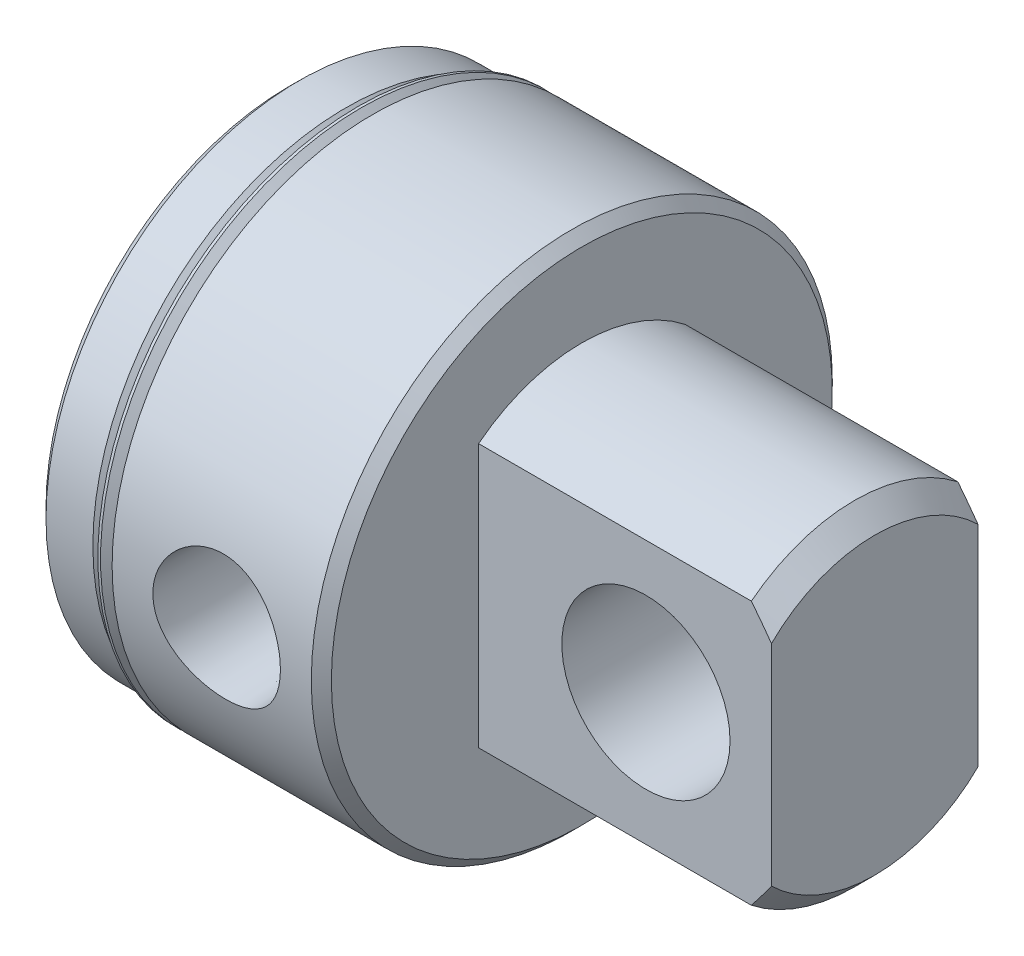
ISO-10303-21;
HEADER;
FILE_DESCRIPTION(('STEP AP214'),'2;1');
FILE_NAME('part.step','',(''),(''),'','','');
FILE_SCHEMA(('AUTOMOTIVE_DESIGN { 1 0 10303 214 1 1 1 1 }'));
ENDSEC;
DATA;
#1=APPLICATION_CONTEXT('core data for automotive mechanical design processes');
#2=APPLICATION_PROTOCOL_DEFINITION('international standard','automotive_design',2000,#1);
#3=PRODUCT_CONTEXT('',#1,'mechanical');
#4=PRODUCT('Part','Part','',(#3));
#5=PRODUCT_RELATED_PRODUCT_CATEGORY('part','',(#4));
#6=PRODUCT_DEFINITION_FORMATION('','',#4);
#7=PRODUCT_DEFINITION_CONTEXT('part definition',#1,'design');
#8=PRODUCT_DEFINITION('design','',#6,#7);
#9=PRODUCT_DEFINITION_SHAPE('','',#8);
#10=(LENGTH_UNIT() NAMED_UNIT(*) SI_UNIT(.MILLI.,.METRE.));
#11=(NAMED_UNIT(*) PLANE_ANGLE_UNIT() SI_UNIT($,.RADIAN.));
#12=(NAMED_UNIT(*) SI_UNIT($,.STERADIAN.) SOLID_ANGLE_UNIT());
#13=UNCERTAINTY_MEASURE_WITH_UNIT(LENGTH_MEASURE(1.E-05),#10,'distance_accuracy_value','');
#14=(GEOMETRIC_REPRESENTATION_CONTEXT(3) GLOBAL_UNCERTAINTY_ASSIGNED_CONTEXT((#13)) GLOBAL_UNIT_ASSIGNED_CONTEXT((#10,
#11,#12)) REPRESENTATION_CONTEXT('',''));
#15=CARTESIAN_POINT('',(0.,0.,0.));
#16=DIRECTION('',(0.,0.,1.));
#17=DIRECTION('',(1.,0.,0.));
#18=AXIS2_PLACEMENT_3D('',#15,#16,#17);
#19=CARTESIAN_POINT('',(4.318,0.,0.));
#20=DIRECTION('',(-1.,0.,0.));
#21=DIRECTION('',(0.,0.,1.));
#22=AXIS2_PLACEMENT_3D('',#19,#20,#21);
#23=CONICAL_SURFACE('',#22,19.19605,0.785398163397448);
#24=CARTESIAN_POINT('',(4.318,0.,0.));
#25=DIRECTION('',(-1.,0.,0.));
#26=DIRECTION('',(0.,0.,1.));
#27=AXIS2_PLACEMENT_3D('',#24,#25,#26);
#28=CIRCLE('',#27,19.19605);
#29=CARTESIAN_POINT('',(4.318,0.,19.19605));
#30=VERTEX_POINT('',#29);
#31=EDGE_CURVE('E621',#30,#30,#28,.T.);
#32=ORIENTED_EDGE('',*,*,#31,.F.);
#33=EDGE_LOOP('',(#32));
#34=FACE_BOUND('',#33,.T.);
#35=CARTESIAN_POINT('',(5.334,0.,0.));
#36=DIRECTION('',(-1.,0.,0.));
#37=DIRECTION('',(0.,0.,1.));
#38=AXIS2_PLACEMENT_3D('',#35,#36,#37);
#39=CIRCLE('',#38,18.18005);
#40=CARTESIAN_POINT('',(5.334,0.,18.18005));
#41=VERTEX_POINT('',#40);
#42=EDGE_CURVE('E631',#41,#41,#39,.F.);
#43=ORIENTED_EDGE('',*,*,#42,.F.);
#44=EDGE_LOOP('',(#43));
#45=FACE_BOUND('',#44,.T.);
#46=ADVANCED_FACE('F17',(#34,#45),#23,.T.);
#47=CARTESIAN_POINT('',(22.225,0.,0.));
#48=DIRECTION('',(-1.,0.,0.));
#49=DIRECTION('',(0.,0.,1.));
#50=AXIS2_PLACEMENT_3D('',#47,#48,#49);
#51=CYLINDRICAL_SURFACE('',#50,18.18005);
#52=ORIENTED_EDGE('',*,*,#42,.T.);
#53=EDGE_LOOP('',(#52));
#54=FACE_BOUND('',#53,.T.);
#55=CARTESIAN_POINT('',(5.8420000000002,0.,0.));
#56=DIRECTION('',(1.,0.,0.));
#57=DIRECTION('',(0.,1.,0.));
#58=AXIS2_PLACEMENT_3D('',#55,#56,#57);
#59=CIRCLE('',#58,18.1800499999999);
#60=CARTESIAN_POINT('',(5.842,18.18005,0.));
#61=VERTEX_POINT('',#60);
#62=EDGE_CURVE('E616',#61,#61,#59,.T.);
#63=ORIENTED_EDGE('',*,*,#62,.F.);
#64=EDGE_LOOP('',(#63));
#65=FACE_BOUND('',#64,.T.);
#66=ADVANCED_FACE('F140',(#54,#65),#51,.T.);
#67=CARTESIAN_POINT('',(22.225,0.,0.));
#68=DIRECTION('',(-1.,0.,0.));
#69=DIRECTION('',(0.,0.,1.));
#70=AXIS2_PLACEMENT_3D('',#67,#68,#69);
#71=CYLINDRICAL_SURFACE('',#70,19.19605);
#72=CARTESIAN_POINT('',(0.761999999999999,0.,0.));
#73=DIRECTION('',(1.,0.,0.));
#74=DIRECTION('',(0.,0.,-1.));
#75=AXIS2_PLACEMENT_3D('',#72,#73,#74);
#76=CIRCLE('',#75,19.19605);
#77=CARTESIAN_POINT('',(0.762,0.,-19.19605));
#78=VERTEX_POINT('',#77);
#79=EDGE_CURVE('E613',#78,#78,#76,.F.);
#80=ORIENTED_EDGE('',*,*,#79,.F.);
#81=EDGE_LOOP('',(#80));
#82=FACE_BOUND('',#81,.T.);
#83=ORIENTED_EDGE('',*,*,#31,.T.);
#84=EDGE_LOOP('',(#83));
#85=FACE_BOUND('',#84,.T.);
#86=ADVANCED_FACE('F137',(#82,#85),#71,.T.);
#87=CARTESIAN_POINT('',(6.21661792847505,0.,0.));
#88=DIRECTION('',(1.,0.,0.));
#89=DIRECTION('',(0.,1.,0.));
#90=AXIS2_PLACEMENT_3D('',#87,#88,#89);
#91=CONICAL_SURFACE('',#90,18.5546679284748,0.785398163397432);
#92=CARTESIAN_POINT('',(6.21661792847505,0.,0.));
#93=DIRECTION('',(1.,0.,0.));
#94=DIRECTION('',(0.,1.,0.));
#95=AXIS2_PLACEMENT_3D('',#92,#93,#94);
#96=CIRCLE('',#95,18.5546679284748);
#97=CARTESIAN_POINT('',(6.21661792847484,18.5546679284748,0.));
#98=VERTEX_POINT('',#97);
#99=EDGE_CURVE('E120',#98,#98,#96,.F.);
#100=ORIENTED_EDGE('',*,*,#99,.T.);
#101=EDGE_LOOP('',(#100));
#102=FACE_BOUND('',#101,.T.);
#103=ORIENTED_EDGE('',*,*,#62,.T.);
#104=EDGE_LOOP('',(#103));
#105=FACE_BOUND('',#104,.T.);
#106=ADVANCED_FACE('F133',(#102,#105),#91,.T.);
#107=CARTESIAN_POINT('',(0.762,0.,0.));
#108=DIRECTION('',(1.,0.,0.));
#109=DIRECTION('',(0.,0.,-1.));
#110=AXIS2_PLACEMENT_3D('',#107,#108,#109);
#111=CONICAL_SURFACE('',#110,19.19605,0.785398163397448);
#112=CARTESIAN_POINT('',(0.,0.,0.));
#113=DIRECTION('',(1.,0.,0.));
#114=DIRECTION('',(0.,0.,-1.));
#115=AXIS2_PLACEMENT_3D('',#112,#113,#114);
#116=CIRCLE('',#115,18.43405);
#117=CARTESIAN_POINT('',(0.,0.,-18.43405));
#118=VERTEX_POINT('',#117);
#119=EDGE_CURVE('E20',#118,#118,#116,.T.);
#120=ORIENTED_EDGE('',*,*,#119,.T.);
#121=EDGE_LOOP('',(#120));
#122=FACE_BOUND('',#121,.T.);
#123=ORIENTED_EDGE('',*,*,#79,.T.);
#124=EDGE_LOOP('',(#123));
#125=FACE_BOUND('',#124,.T.);
#126=ADVANCED_FACE('F128',(#122,#125),#111,.T.);
#127=CARTESIAN_POINT('',(6.12681536726437,0.,0.));
#128=DIRECTION('',(1.,0.,0.));
#129=DIRECTION('',(0.,1.,0.));
#130=AXIS2_PLACEMENT_3D('',#127,#128,#129);
#131=TOROIDAL_SURFACE('',#130,18.6444704896855,0.126999999999998);
#132=ORIENTED_EDGE('',*,*,#99,.F.);
#133=EDGE_LOOP('',(#132));
#134=FACE_BOUND('',#133,.T.);
#135=CARTESIAN_POINT('',(6.21661792847505,0.,0.));
#136=DIRECTION('',(-1.,0.,0.));
#137=DIRECTION('',(0.,-1.,0.));
#138=AXIS2_PLACEMENT_3D('',#135,#136,#137);
#139=CIRCLE('',#138,18.7342730508961);
#140=CARTESIAN_POINT('',(6.21661792847526,-18.7342730508961,0.));
#141=VERTEX_POINT('',#140);
#142=EDGE_CURVE('E113',#141,#141,#139,.T.);
#143=ORIENTED_EDGE('',*,*,#142,.T.);
#144=EDGE_LOOP('',(#143));
#145=FACE_BOUND('',#144,.T.);
#146=ADVANCED_FACE('F123',(#134,#145),#131,.F.);
#147=CARTESIAN_POINT('',(0.,0.,0.));
#148=DIRECTION('',(1.,0.,0.));
#149=DIRECTION('',(0.,0.,-1.));
#150=AXIS2_PLACEMENT_3D('',#147,#148,#149);
#151=PLANE('',#150);
#152=CARTESIAN_POINT('',(0.,0.,0.));
#153=DIRECTION('',(-1.,0.,0.));
#154=DIRECTION('',(0.,0.,1.));
#155=AXIS2_PLACEMENT_3D('',#152,#153,#154);
#156=CIRCLE('',#155,12.3063);
#157=CARTESIAN_POINT('',(0.,0.,12.3063));
#158=VERTEX_POINT('',#157);
#159=EDGE_CURVE('E82',#158,#158,#156,.F.);
#160=ORIENTED_EDGE('',*,*,#159,.T.);
#161=EDGE_LOOP('',(#160));
#162=FACE_BOUND('',#161,.T.);
#163=ORIENTED_EDGE('',*,*,#119,.F.);
#164=EDGE_LOOP('',(#163));
#165=FACE_BOUND('',#164,.T.);
#166=ADVANCED_FACE('F127',(#162,#165),#151,.F.);
#167=CARTESIAN_POINT('',(5.26750917524549,0.,0.));
#168=DIRECTION('',(-1.,0.,0.));
#169=DIRECTION('',(0.,-1.,0.));
#170=AXIS2_PLACEMENT_3D('',#167,#168,#169);
#171=CONICAL_SURFACE('',#170,19.6833818041257,0.78539816339746);
#172=CARTESIAN_POINT('',(5.26750917524549,0.,0.));
#173=DIRECTION('',(-1.,0.,0.));
#174=DIRECTION('',(0.,-1.,0.));
#175=AXIS2_PLACEMENT_3D('',#172,#173,#174);
#176=CIRCLE('',#175,19.6833818041257);
#177=CARTESIAN_POINT('',(5.26750917524571,-19.6833818041257,0.));
#178=VERTEX_POINT('',#177);
#179=EDGE_CURVE('E247',#178,#178,#176,.F.);
#180=ORIENTED_EDGE('',*,*,#179,.F.);
#181=EDGE_LOOP('',(#180));
#182=FACE_BOUND('',#181,.T.);
#183=ORIENTED_EDGE('',*,*,#142,.F.);
#184=EDGE_LOOP('',(#183));
#185=FACE_BOUND('',#184,.T.);
#186=ADVANCED_FACE('F262',(#182,#185),#171,.F.);
#187=CARTESIAN_POINT('',(6.35,0.,0.));
#188=DIRECTION('',(-1.,0.,0.));
#189=DIRECTION('',(0.,0.,1.));
#190=AXIS2_PLACEMENT_3D('',#187,#188,#189);
#191=CYLINDRICAL_SURFACE('',#190,12.3063);
#192=ORIENTED_EDGE('',*,*,#159,.F.);
#193=EDGE_LOOP('',(#192));
#194=FACE_BOUND('',#193,.T.);
#195=CARTESIAN_POINT('',(6.35,0.,0.));
#196=DIRECTION('',(-1.,0.,0.));
#197=DIRECTION('',(0.,0.,1.));
#198=AXIS2_PLACEMENT_3D('',#195,#196,#197);
#199=CIRCLE('',#198,12.3063);
#200=CARTESIAN_POINT('',(6.35,0.,12.3063));
#201=VERTEX_POINT('',#200);
#202=EDGE_CURVE('E250',#201,#201,#199,.T.);
#203=ORIENTED_EDGE('',*,*,#202,.F.);
#204=EDGE_LOOP('',(#203));
#205=FACE_BOUND('',#204,.T.);
#206=ADVANCED_FACE('F258',(#194,#205),#191,.F.);
#207=CARTESIAN_POINT('',(34.925,0.,11.75385));
#208=DIRECTION('',(0.,0.,1.));
#209=DIRECTION('',(1.,0.,0.));
#210=AXIS2_PLACEMENT_3D('',#207,#208,#209);
#211=CYLINDRICAL_SURFACE('',#210,6.38175);
#212=CARTESIAN_POINT('',(34.925,0.,7.8359));
#213=DIRECTION('',(0.,0.,1.));
#214=DIRECTION('',(1.,0.,0.));
#215=AXIS2_PLACEMENT_3D('',#212,#213,#214);
#216=CIRCLE('',#215,6.38175);
#217=CARTESIAN_POINT('',(41.30675,0.,7.8359));
#218=VERTEX_POINT('',#217);
#219=EDGE_CURVE('E267',#218,#218,#216,.F.);
#220=ORIENTED_EDGE('',*,*,#219,.F.);
#221=EDGE_LOOP('',(#220));
#222=FACE_BOUND('',#221,.T.);
#223=CARTESIAN_POINT('',(34.925,0.,-7.8359));
#224=DIRECTION('',(0.,0.,1.));
#225=DIRECTION('',(1.,0.,0.));
#226=AXIS2_PLACEMENT_3D('',#223,#224,#225);
#227=CIRCLE('',#226,6.38175);
#228=CARTESIAN_POINT('',(41.30675,0.,-7.8359));
#229=VERTEX_POINT('',#228);
#230=EDGE_CURVE('E96',#229,#229,#227,.T.);
#231=ORIENTED_EDGE('',*,*,#230,.F.);
#232=EDGE_LOOP('',(#231));
#233=FACE_BOUND('',#232,.T.);
#234=ADVANCED_FACE('F261',(#222,#233),#211,.F.);
#235=CARTESIAN_POINT('',(44.45,11.176,0.));
#236=DIRECTION('',(-1.,0.,0.));
#237=DIRECTION('',(0.,0.,1.));
#238=AXIS2_PLACEMENT_3D('',#235,#236,#237);
#239=PLANE('',#238);
#240=CARTESIAN_POINT('',(44.45,0.,0.));
#241=DIRECTION('',(-1.,0.,0.));
#242=DIRECTION('',(0.,0.,1.));
#243=AXIS2_PLACEMENT_3D('',#240,#241,#242);
#244=CIRCLE('',#243,11.176);
#245=CARTESIAN_POINT('',(44.45,-7.96879207847713,-7.8359));
#246=VERTEX_POINT('',#245);
#247=CARTESIAN_POINT('',(44.45,-7.96879207847713,7.8359));
#248=VERTEX_POINT('',#247);
#249=EDGE_CURVE('E71',#246,#248,#244,.T.);
#250=ORIENTED_EDGE('',*,*,#249,.F.);
#251=DIRECTION('',(0.,1.,0.));
#252=VECTOR('',#251,1.);
#253=CARTESIAN_POINT('',(44.45,-39.5351,-7.8359));
#254=LINE('',#253,#252);
#255=CARTESIAN_POINT('',(44.45,7.96879207847713,-7.8359));
#256=VERTEX_POINT('',#255);
#257=EDGE_CURVE('E75',#256,#246,#254,.F.);
#258=ORIENTED_EDGE('',*,*,#257,.F.);
#259=CARTESIAN_POINT('',(44.45,0.,0.));
#260=DIRECTION('',(-1.,0.,0.));
#261=DIRECTION('',(0.,0.,1.));
#262=AXIS2_PLACEMENT_3D('',#259,#260,#261);
#263=CIRCLE('',#262,11.176);
#264=CARTESIAN_POINT('',(44.45,7.96879207847713,7.8359));
#265=VERTEX_POINT('',#264);
#266=EDGE_CURVE('E81',#265,#256,#263,.T.);
#267=ORIENTED_EDGE('',*,*,#266,.F.);
#268=DIRECTION('',(0.,-1.,0.));
#269=VECTOR('',#268,1.);
#270=CARTESIAN_POINT('',(44.45,39.5351,7.8359));
#271=LINE('',#270,#269);
#272=EDGE_CURVE('E78',#248,#265,#271,.F.);
#273=ORIENTED_EDGE('',*,*,#272,.F.);
#274=EDGE_LOOP('',(#250,#258,#267,#273));
#275=FACE_BOUND('',#274,.T.);
#276=ADVANCED_FACE('F73',(#275),#239,.F.);
#277=CARTESIAN_POINT('',(42.926,0.,0.));
#278=DIRECTION('',(-1.,0.,0.));
#279=DIRECTION('',(0.,0.,1.));
#280=AXIS2_PLACEMENT_3D('',#277,#278,#279);
#281=CONICAL_SURFACE('',#280,12.7,0.78539816339745);
#282=CARTESIAN_POINT('',(44.45,-7.96879207847713,-7.8359));
#283=CARTESIAN_POINT('',(44.3273297510162,-8.14081679214277,-7.8359));
#284=CARTESIAN_POINT('',(44.2033839669076,-8.31192583288956,-7.8359));
#285=CARTESIAN_POINT('',(43.9532525563909,-8.65246330618877,-7.8359));
#286=CARTESIAN_POINT('',(43.8270672427883,-8.82189196837379,-7.8359));
#287=CARTESIAN_POINT('',(43.5727371570461,-9.15926260270434,-7.8359));
#288=CARTESIAN_POINT('',(43.4445924361652,-9.32720461356031,-7.8359));
#289=CARTESIAN_POINT('',(43.1865499732579,-9.6617741203872,-7.8359));
#290=CARTESIAN_POINT('',(43.0566519909108,-9.828401431088,-7.8359));
#291=CARTESIAN_POINT('',(42.926,-9.99443200937402,-7.8359));
#292=B_SPLINE_CURVE_WITH_KNOTS('',3,(#282,#283,#284,#285,#286,#287,#288,#289,#290,#291),
.UNSPECIFIED.,.F.,.F.,(4,2,2,2,4),(0.,0.633835934288274,1.26758402384161,1.90131556260546,
2.53513486774774),.UNSPECIFIED.);
#293=CARTESIAN_POINT('',(42.926,-9.99443200937403,-7.8359));
#294=VERTEX_POINT('',#293);
#295=EDGE_CURVE('E85',#246,#294,#292,.T.);
#296=ORIENTED_EDGE('',*,*,#295,.F.);
#297=ORIENTED_EDGE('',*,*,#249,.T.);
#298=CARTESIAN_POINT('',(42.926,-9.99443200937403,7.8359));
#299=CARTESIAN_POINT('',(43.0566519909108,-9.828401431088,7.8359));
#300=CARTESIAN_POINT('',(43.1865499732579,-9.6617741203872,7.8359));
#301=CARTESIAN_POINT('',(43.4445924361652,-9.32720461356031,7.8359));
#302=CARTESIAN_POINT('',(43.5727371570461,-9.15926260270434,7.8359));
#303=CARTESIAN_POINT('',(43.8270672427883,-8.82189196837379,7.8359));
#304=CARTESIAN_POINT('',(43.9532525563909,-8.65246330618877,7.8359));
#305=CARTESIAN_POINT('',(44.2033839669076,-8.31192583288956,7.8359));
#306=CARTESIAN_POINT('',(44.3273297510162,-8.14081679214277,7.8359));
#307=CARTESIAN_POINT('',(44.45,-7.96879207847713,7.8359));
#308=B_SPLINE_CURVE_WITH_KNOTS('',3,(#298,#299,#300,#301,#302,#303,#304,#305,#306,#307),
.UNSPECIFIED.,.F.,.F.,(4,2,2,2,4),(0.,0.633819305142281,1.26755084390612,1.90129893345947,
2.53513486774774),.UNSPECIFIED.);
#309=CARTESIAN_POINT('',(42.926,-9.99443200937403,7.8359));
#310=VERTEX_POINT('',#309);
#311=EDGE_CURVE('E106',#310,#248,#308,.T.);
#312=ORIENTED_EDGE('',*,*,#311,.F.);
#313=CARTESIAN_POINT('',(42.926,0.,0.));
#314=DIRECTION('',(-1.,0.,0.));
#315=DIRECTION('',(0.,0.,1.));
#316=AXIS2_PLACEMENT_3D('',#313,#314,#315);
#317=CIRCLE('',#316,12.7);
#318=EDGE_CURVE('E88',#294,#310,#317,.T.);
#319=ORIENTED_EDGE('',*,*,#318,.F.);
#320=EDGE_LOOP('',(#296,#297,#312,#319));
#321=FACE_BOUND('',#320,.T.);
#322=ADVANCED_FACE('F86',(#321),#281,.T.);
#323=CARTESIAN_POINT('',(42.926,0.,0.));
#324=DIRECTION('',(-1.,0.,0.));
#325=DIRECTION('',(0.,0.,1.));
#326=AXIS2_PLACEMENT_3D('',#323,#324,#325);
#327=CONICAL_SURFACE('',#326,12.7,0.78539816339745);
#328=CARTESIAN_POINT('',(44.45,7.96879207847714,7.8359));
#329=CARTESIAN_POINT('',(44.3273297510162,8.14081679214278,7.8359));
#330=CARTESIAN_POINT('',(44.2033839669076,8.31192583288957,7.8359));
#331=CARTESIAN_POINT('',(43.9532525563909,8.65246330618877,7.8359));
#332=CARTESIAN_POINT('',(43.8270672427883,8.82189196837379,7.8359));
#333=CARTESIAN_POINT('',(43.5727371570461,9.15926260270434,7.8359));
#334=CARTESIAN_POINT('',(43.4445924361652,9.32720461356031,7.8359));
#335=CARTESIAN_POINT('',(43.1865499732579,9.6617741203872,7.8359));
#336=CARTESIAN_POINT('',(43.0566519909108,9.828401431088,7.8359));
#337=CARTESIAN_POINT('',(42.926,9.99443200937403,7.8359));
#338=B_SPLINE_CURVE_WITH_KNOTS('',3,(#328,#329,#330,#331,#332,#333,#334,#335,#336,#337),
.UNSPECIFIED.,.F.,.F.,(4,2,2,2,4),(0.,0.633835934288273,1.26758402384162,1.90131556260546,
2.53513486774774),.UNSPECIFIED.);
#339=CARTESIAN_POINT('',(42.926,9.99443200937403,7.8359));
#340=VERTEX_POINT('',#339);
#341=EDGE_CURVE('E104',#265,#340,#338,.T.);
#342=ORIENTED_EDGE('',*,*,#341,.F.);
#343=ORIENTED_EDGE('',*,*,#266,.T.);
#344=CARTESIAN_POINT('',(42.926,9.99443200937403,-7.8359));
#345=CARTESIAN_POINT('',(43.0566519909108,9.828401431088,-7.8359));
#346=CARTESIAN_POINT('',(43.1865499732579,9.6617741203872,-7.8359));
#347=CARTESIAN_POINT('',(43.4445924361652,9.32720461356031,-7.8359));
#348=CARTESIAN_POINT('',(43.5727371570461,9.15926260270434,-7.8359));
#349=CARTESIAN_POINT('',(43.8270672427883,8.82189196837379,-7.8359));
#350=CARTESIAN_POINT('',(43.9532525563909,8.65246330618877,-7.8359));
#351=CARTESIAN_POINT('',(44.2033839669076,8.31192583288956,-7.8359));
#352=CARTESIAN_POINT('',(44.3273297510162,8.14081679214277,-7.8359));
#353=CARTESIAN_POINT('',(44.45,7.96879207847713,-7.8359));
#354=B_SPLINE_CURVE_WITH_KNOTS('',3,(#344,#345,#346,#347,#348,#349,#350,#351,#352,#353),
.UNSPECIFIED.,.F.,.F.,(4,2,2,2,4),(0.,0.633819305142279,1.26755084390612,1.90129893345947,
2.53513486774774),.UNSPECIFIED.);
#355=CARTESIAN_POINT('',(42.926,9.99443200937402,-7.8359));
#356=VERTEX_POINT('',#355);
#357=EDGE_CURVE('E94',#356,#256,#354,.T.);
#358=ORIENTED_EDGE('',*,*,#357,.F.);
#359=CARTESIAN_POINT('',(42.926,0.,0.));
#360=DIRECTION('',(-1.,0.,0.));
#361=DIRECTION('',(0.,0.,1.));
#362=AXIS2_PLACEMENT_3D('',#359,#360,#361);
#363=CIRCLE('',#362,12.7);
#364=EDGE_CURVE('E107',#340,#356,#363,.T.);
#365=ORIENTED_EDGE('',*,*,#364,.F.);
#366=EDGE_LOOP('',(#342,#343,#358,#365));
#367=FACE_BOUND('',#366,.T.);
#368=ADVANCED_FACE('F246',(#367),#327,.T.);
#369=CARTESIAN_POINT('',(5.26750917524526,19.76755,0.));
#370=DIRECTION('',(-1.,0.,0.));
#371=DIRECTION('',(0.,-1.,0.));
#372=AXIS2_PLACEMENT_3D('',#369,#370,#371);
#373=PLANE('',#372);
#374=CARTESIAN_POINT('',(5.26750917524548,0.,0.));
#375=DIRECTION('',(-1.,0.,0.));
#376=DIRECTION('',(0.,-1.,0.));
#377=AXIS2_PLACEMENT_3D('',#374,#375,#376);
#378=CIRCLE('',#377,19.76755);
#379=CARTESIAN_POINT('',(5.2675091752457,-19.7675499999999,0.));
#380=VERTEX_POINT('',#379);
#381=EDGE_CURVE('E110',#380,#380,#378,.F.);
#382=ORIENTED_EDGE('',*,*,#381,.F.);
#383=EDGE_LOOP('',(#382));
#384=FACE_BOUND('',#383,.T.);
#385=ORIENTED_EDGE('',*,*,#179,.T.);
#386=EDGE_LOOP('',(#385));
#387=FACE_BOUND('',#386,.T.);
#388=ADVANCED_FACE('F316',(#384,#387),#373,.T.);
#389=CARTESIAN_POINT('',(20.4520800000978,0.,0.));
#390=DIRECTION('',(-1.,0.,0.));
#391=DIRECTION('',(0.,0.,1.));
#392=AXIS2_PLACEMENT_3D('',#389,#390,#391);
#393=CONICAL_SURFACE('',#392,6.75639999974464,1.04719755116552);
#394=CARTESIAN_POINT('',(24.3528893587381,0.,-5.6843418860808E-11));
#395=VERTEX_POINT('',#394);
#396=VERTEX_LOOP('',#395);
#397=FACE_BOUND('',#396,.T.);
#398=CARTESIAN_POINT('',(20.45208,0.,0.));
#399=DIRECTION('',(-1.,0.,0.));
#400=DIRECTION('',(0.,0.,1.));
#401=AXIS2_PLACEMENT_3D('',#398,#399,#400);
#402=CIRCLE('',#401,6.7564);
#403=CARTESIAN_POINT('',(20.45208,0.,6.7564));
#404=VERTEX_POINT('',#403);
#405=EDGE_CURVE('E229',#404,#404,#402,.T.);
#406=ORIENTED_EDGE('',*,*,#405,.T.);
#407=EDGE_LOOP('',(#406));
#408=FACE_BOUND('',#407,.T.);
#409=ADVANCED_FACE('F313',(#397,#408),#393,.F.);
#410=CARTESIAN_POINT('',(6.35,12.3063,0.));
#411=DIRECTION('',(-1.,0.,0.));
#412=DIRECTION('',(0.,0.,1.));
#413=AXIS2_PLACEMENT_3D('',#410,#411,#412);
#414=PLANE('',#413);
#415=ORIENTED_EDGE('',*,*,#202,.T.);
#416=EDGE_LOOP('',(#415));
#417=FACE_BOUND('',#416,.T.);
#418=CARTESIAN_POINT('',(6.35,0.,0.));
#419=DIRECTION('',(-1.,0.,0.));
#420=DIRECTION('',(0.,0.,1.));
#421=AXIS2_PLACEMENT_3D('',#418,#419,#420);
#422=CIRCLE('',#421,6.7564);
#423=CARTESIAN_POINT('',(6.35,0.,6.7564));
#424=VERTEX_POINT('',#423);
#425=EDGE_CURVE('E228',#424,#424,#422,.F.);
#426=ORIENTED_EDGE('',*,*,#425,.T.);
#427=EDGE_LOOP('',(#426));
#428=FACE_BOUND('',#427,.T.);
#429=ADVANCED_FACE('F310',(#417,#428),#414,.T.);
#430=CARTESIAN_POINT('',(22.225,39.5351,7.8359));
#431=DIRECTION('',(0.,0.,1.));
#432=DIRECTION('',(0.,-1.,0.));
#433=AXIS2_PLACEMENT_3D('',#430,#431,#432);
#434=PLANE('',#433);
#435=DIRECTION('',(-1.,0.,0.));
#436=VECTOR('',#435,1.);
#437=CARTESIAN_POINT('',(44.45,9.99443200937402,7.83589999999999));
#438=LINE('',#437,#436);
#439=CARTESIAN_POINT('',(22.225,9.99443200937402,7.8359));
#440=VERTEX_POINT('',#439);
#441=EDGE_CURVE('E111',#440,#340,#438,.F.);
#442=ORIENTED_EDGE('',*,*,#441,.F.);
#443=DIRECTION('',(0.,1.,0.));
#444=VECTOR('',#443,1.);
#445=CARTESIAN_POINT('',(22.225,19.00555,7.8359));
#446=LINE('',#445,#444);
#447=CARTESIAN_POINT('',(22.225,-9.99443200937402,7.8359));
#448=VERTEX_POINT('',#447);
#449=EDGE_CURVE('E222',#440,#448,#446,.F.);
#450=ORIENTED_EDGE('',*,*,#449,.T.);
#451=DIRECTION('',(-1.,0.,0.));
#452=VECTOR('',#451,1.);
#453=CARTESIAN_POINT('',(44.45,-9.99443200937402,7.83589999999999));
#454=LINE('',#453,#452);
#455=EDGE_CURVE('E101',#310,#448,#454,.T.);
#456=ORIENTED_EDGE('',*,*,#455,.F.);
#457=ORIENTED_EDGE('',*,*,#311,.T.);
#458=ORIENTED_EDGE('',*,*,#272,.T.);
#459=ORIENTED_EDGE('',*,*,#341,.T.);
#460=EDGE_LOOP('',(#442,#450,#456,#457,#458,#459));
#461=FACE_BOUND('',#460,.T.);
#462=ORIENTED_EDGE('',*,*,#219,.T.);
#463=EDGE_LOOP('',(#462));
#464=FACE_BOUND('',#463,.T.);
#465=ADVANCED_FACE('F240',(#461,#464),#434,.T.);
#466=CARTESIAN_POINT('',(44.45,0.,0.));
#467=DIRECTION('',(-1.,0.,0.));
#468=DIRECTION('',(0.,0.,1.));
#469=AXIS2_PLACEMENT_3D('',#466,#467,#468);
#470=CYLINDRICAL_SURFACE('',#469,12.7);
#471=DIRECTION('',(1.,0.,0.));
#472=VECTOR('',#471,1.);
#473=CARTESIAN_POINT('',(22.225,-9.99443200937403,-7.8359));
#474=LINE('',#473,#472);
#475=CARTESIAN_POINT('',(22.225,-9.99443200937403,-7.8359));
#476=VERTEX_POINT('',#475);
#477=EDGE_CURVE('E90',#294,#476,#474,.F.);
#478=ORIENTED_EDGE('',*,*,#477,.F.);
#479=ORIENTED_EDGE('',*,*,#318,.T.);
#480=ORIENTED_EDGE('',*,*,#455,.T.);
#481=CARTESIAN_POINT('',(22.225,0.,0.));
#482=DIRECTION('',(-1.,0.,0.));
#483=DIRECTION('',(0.,0.,1.));
#484=AXIS2_PLACEMENT_3D('',#481,#482,#483);
#485=CIRCLE('',#484,12.7);
#486=EDGE_CURVE('E219',#448,#476,#485,.F.);
#487=ORIENTED_EDGE('',*,*,#486,.T.);
#488=EDGE_LOOP('',(#478,#479,#480,#487));
#489=FACE_BOUND('',#488,.T.);
#490=ADVANCED_FACE('F303',(#489),#470,.T.);
#491=CARTESIAN_POINT('',(22.225,-39.5351,-7.8359));
#492=DIRECTION('',(0.,0.,-1.));
#493=DIRECTION('',(0.,1.,0.));
#494=AXIS2_PLACEMENT_3D('',#491,#492,#493);
#495=PLANE('',#494);
#496=ORIENTED_EDGE('',*,*,#477,.T.);
#497=DIRECTION('',(0.,1.,0.));
#498=VECTOR('',#497,1.);
#499=CARTESIAN_POINT('',(22.225,19.00555,-7.8359));
#500=LINE('',#499,#498);
#501=CARTESIAN_POINT('',(22.225,9.99443200937402,-7.8359));
#502=VERTEX_POINT('',#501);
#503=EDGE_CURVE('E35',#476,#502,#500,.T.);
#504=ORIENTED_EDGE('',*,*,#503,.T.);
#505=DIRECTION('',(-1.,0.,0.));
#506=VECTOR('',#505,1.);
#507=CARTESIAN_POINT('',(44.45,9.99443200937402,-7.83589999999999));
#508=LINE('',#507,#506);
#509=EDGE_CURVE('E234',#356,#502,#508,.T.);
#510=ORIENTED_EDGE('',*,*,#509,.F.);
#511=ORIENTED_EDGE('',*,*,#357,.T.);
#512=ORIENTED_EDGE('',*,*,#257,.T.);
#513=ORIENTED_EDGE('',*,*,#295,.T.);
#514=EDGE_LOOP('',(#496,#504,#510,#511,#512,#513));
#515=FACE_BOUND('',#514,.T.);
#516=ORIENTED_EDGE('',*,*,#230,.T.);
#517=EDGE_LOOP('',(#516));
#518=FACE_BOUND('',#517,.T.);
#519=ADVANCED_FACE('F92',(#515,#518),#495,.T.);
#520=CARTESIAN_POINT('',(44.45,0.,0.));
#521=DIRECTION('',(-1.,0.,0.));
#522=DIRECTION('',(0.,0.,1.));
#523=AXIS2_PLACEMENT_3D('',#520,#521,#522);
#524=CYLINDRICAL_SURFACE('',#523,12.7);
#525=ORIENTED_EDGE('',*,*,#441,.T.);
#526=ORIENTED_EDGE('',*,*,#364,.T.);
#527=ORIENTED_EDGE('',*,*,#509,.T.);
#528=CARTESIAN_POINT('',(22.225,0.,0.));
#529=DIRECTION('',(-1.,0.,0.));
#530=DIRECTION('',(0.,0.,1.));
#531=AXIS2_PLACEMENT_3D('',#528,#529,#530);
#532=CIRCLE('',#531,12.7);
#533=EDGE_CURVE('E190',#502,#440,#532,.F.);
#534=ORIENTED_EDGE('',*,*,#533,.T.);
#535=EDGE_LOOP('',(#525,#526,#527,#534));
#536=FACE_BOUND('',#535,.T.);
#537=ADVANCED_FACE('F237',(#536),#524,.T.);
#538=CARTESIAN_POINT('',(6.3500000000002,0.,0.));
#539=DIRECTION('',(-1.,0.,0.));
#540=DIRECTION('',(0.,-1.,0.));
#541=AXIS2_PLACEMENT_3D('',#538,#539,#540);
#542=CYLINDRICAL_SURFACE('',#541,19.76755);
#543=CARTESIAN_POINT('',(5.47070917524548,0.,0.));
#544=DIRECTION('',(-1.,0.,0.));
#545=DIRECTION('',(0.,-1.,0.));
#546=AXIS2_PLACEMENT_3D('',#543,#544,#545);
#547=CIRCLE('',#546,19.7675499999999);
#548=CARTESIAN_POINT('',(5.4707091752457,-19.7675499999999,0.));
#549=VERTEX_POINT('',#548);
#550=EDGE_CURVE('E189',#549,#549,#547,.F.);
#551=ORIENTED_EDGE('',*,*,#550,.F.);
#552=EDGE_LOOP('',(#551));
#553=FACE_BOUND('',#552,.T.);
#554=ORIENTED_EDGE('',*,*,#381,.T.);
#555=EDGE_LOOP('',(#554));
#556=FACE_BOUND('',#555,.T.);
#557=ADVANCED_FACE('F212',(#553,#556),#542,.T.);
#558=CARTESIAN_POINT('',(24.3528893587528,0.,0.));
#559=DIRECTION('',(-1.,0.,0.));
#560=DIRECTION('',(0.,0.,1.));
#561=AXIS2_PLACEMENT_3D('',#558,#559,#560);
#562=CYLINDRICAL_SURFACE('',#561,6.7564);
#563=ORIENTED_EDGE('',*,*,#425,.F.);
#564=EDGE_LOOP('',(#563));
#565=FACE_BOUND('',#564,.T.);
#566=CARTESIAN_POINT('',(14.5104816791738,-4.70236777623638,4.8514614557898));
#567=CARTESIAN_POINT('',(14.6265333317476,-4.69654084702803,4.8571097131393));
#568=CARTESIAN_POINT('',(14.7421718554648,-4.68641152352722,4.86691748185736));
#569=CARTESIAN_POINT('',(14.9714699353933,-4.65778808204712,4.89431694760706));
#570=CARTESIAN_POINT('',(15.08512914801,-4.63929252648792,4.91190998237921));
#571=CARTESIAN_POINT('',(15.3097277436792,-4.5942816154924,4.95403510104126));
#572=CARTESIAN_POINT('',(15.4206621619626,-4.56775264761913,4.97857895833496));
#573=CARTESIAN_POINT('',(15.6389751898822,-4.50712791609919,5.03352904151548));
#574=CARTESIAN_POINT('',(15.7463518388558,-4.47302805734912,5.06393843890692));
#575=CARTESIAN_POINT('',(16.0598975802594,-4.36093279131718,5.16148274604132));
#576=CARTESIAN_POINT('',(16.2603012929209,-4.27255807653757,5.23551442600585));
#577=CARTESIAN_POINT('',(16.6433481846047,-4.07084521250423,5.39384987291372));
#578=CARTESIAN_POINT('',(16.8259898399015,-3.95750492428647,5.47815451973266));
#579=CARTESIAN_POINT('',(17.204944032201,-3.68428508179761,5.666332361255));
#580=CARTESIAN_POINT('',(17.3975065753679,-3.51967246199358,5.77093431840504));
#581=CARTESIAN_POINT('',(17.7540404601501,-3.1595710649448,5.97570221177032));
#582=CARTESIAN_POINT('',(17.9180116819595,-2.96408215832618,6.07586812939599));
#583=CARTESIAN_POINT('',(18.2002858459154,-2.56267358522543,6.25503501252746));
#584=CARTESIAN_POINT('',(18.3213478076061,-2.35921260311695,6.3351248897179));
#585=CARTESIAN_POINT('',(18.4793750192528,-2.03836619773547,6.44257648261182));
#586=CARTESIAN_POINT('',(18.5281326986022,-1.92877785752953,6.47628688964414));
#587=CARTESIAN_POINT('',(18.6172526964593,-1.70490647303998,6.53878522117089));
#588=CARTESIAN_POINT('',(18.6576188609588,-1.59062560831792,6.56757539961904));
#589=CARTESIAN_POINT('',(18.7296951930756,-1.35715722632899,6.6197799489805));
#590=CARTESIAN_POINT('',(18.7613364510839,-1.23793874932371,6.64315130380372));
#591=CARTESIAN_POINT('',(18.8150410743834,-0.996375448847134,6.68364890902664));
#592=CARTESIAN_POINT('',(18.8371091306811,-0.874032187756714,6.70077821745905));
#593=CARTESIAN_POINT('',(18.8712991498986,-0.627256714981686,6.72836529604117));
#594=CARTESIAN_POINT('',(18.8834243418115,-0.502825194876062,6.73882523185609));
#595=CARTESIAN_POINT('',(18.8975138891152,-0.253006869226177,6.75281965422786));
#596=CARTESIAN_POINT('',(18.8994794409255,-0.12762017790648,6.75635495621296));
#597=CARTESIAN_POINT('',(18.8936000506929,0.10763103563551,6.75643877899981));
#598=CARTESIAN_POINT('',(18.8869203007439,0.217526928066603,6.75378547073958));
#599=CARTESIAN_POINT('',(18.8657968647935,0.436346738150583,6.74318504377307));
#600=CARTESIAN_POINT('',(18.8513507536919,0.545270341393342,6.73523627133566));
#601=CARTESIAN_POINT('',(18.8148969035939,0.761308435295665,6.71424757552949));
#602=CARTESIAN_POINT('',(18.7928916878832,0.868423517151111,6.70120935086018));
#603=CARTESIAN_POINT('',(18.7416092314073,1.08021006329275,6.67034968419462));
#604=CARTESIAN_POINT('',(18.7123291672171,1.18488056152153,6.65252638485709));
#605=CARTESIAN_POINT('',(18.614001292773,1.49450176923658,6.59238276275585));
#606=CARTESIAN_POINT('',(18.5344841648385,1.69495567807093,6.54339961186248));
#607=CARTESIAN_POINT('',(18.3507898221652,2.07977783953011,6.43146650559322));
#608=CARTESIAN_POINT('',(18.2466080294343,2.26414309724623,6.36851395750287));
#609=CARTESIAN_POINT('',(18.0007592254152,2.6387041401753,6.22348759778808));
#610=CARTESIAN_POINT('',(17.855915032752,2.82625280596699,6.13997634227367));
#611=CARTESIAN_POINT('',(17.5412558729062,3.17618735775941,5.96648788452356));
#612=CARTESIAN_POINT('',(17.3714007194176,3.33853186817346,5.87650039785192));
#613=CARTESIAN_POINT('',(17.084911830223,3.57384638159372,5.73470195816266));
#614=CARTESIAN_POINT('',(16.9756849614742,3.65582215378504,5.68264602525485));
#615=CARTESIAN_POINT('',(16.7498724021569,3.81019392662601,5.5803184041224));
#616=CARTESIAN_POINT('',(16.6332849278413,3.88258759191312,5.5300471530392));
#617=CARTESIAN_POINT('',(16.2731817877805,4.08440088847036,5.38460139933999));
#618=CARTESIAN_POINT('',(16.0187431225983,4.19893452099066,5.2944896391127));
#619=CARTESIAN_POINT('',(15.5654315930317,4.35402347624742,5.16704949261568));
#620=CARTESIAN_POINT('',(15.3728148233679,4.40646568276377,5.12199650739026));
#621=CARTESIAN_POINT('',(15.0774943218712,4.46608011249738,5.0698851758431));
#622=CARTESIAN_POINT('',(14.978024795647,4.48277421962124,5.0550952710766));
#623=CARTESIAN_POINT('',(14.777541109376,4.50956658934419,5.03121082279996));
#624=CARTESIAN_POINT('',(14.6765275374714,4.51966730236552,5.02211416345796));
#625=CARTESIAN_POINT('',(14.4731555132118,4.53312032064598,5.00997435732916));
#626=CARTESIAN_POINT('',(14.3707927945833,4.53643716038148,5.00696302509961));
#627=CARTESIAN_POINT('',(14.1660856337484,4.53615101015016,5.00722230052894));
#628=CARTESIAN_POINT('',(14.0637411915334,4.53254802343978,5.01049290523155));
#629=CARTESIAN_POINT('',(13.8598662434987,4.5184900976393,5.02317406007164));
#630=CARTESIAN_POINT('',(13.7583360951774,4.50803229970044,5.032587171979));
#631=CARTESIAN_POINT('',(13.5568700196061,4.48046341225801,5.05714566300101));
#632=CARTESIAN_POINT('',(13.4569347706461,4.46334956659758,5.07229341666466));
#633=CARTESIAN_POINT('',(13.1716693032959,4.40472630911168,5.12347026500912));
#634=CARTESIAN_POINT('',(12.9891402491093,4.35503752411642,5.16610849968991));
#635=CARTESIAN_POINT('',(12.6348560280621,4.23515021713467,5.26482809848632));
#636=CARTESIAN_POINT('',(12.4631094031294,4.1649356774476,5.32091995525607));
#637=CARTESIAN_POINT('',(12.1732810034876,4.02592604377847,5.42645949460599));
#638=CARTESIAN_POINT('',(12.0525360887013,3.96118423652385,5.47404993536686));
#639=CARTESIAN_POINT('',(11.8181031278761,3.82190253270472,5.57218581184887));
#640=CARTESIAN_POINT('',(11.7044152927934,3.74736234344604,5.62273133581827));
#641=CARTESIAN_POINT('',(11.4841764149559,3.58882345557174,5.72522626899891));
#642=CARTESIAN_POINT('',(11.3776385333773,3.50480803819291,5.7771780327859));
#643=CARTESIAN_POINT('',(11.1722271803281,3.32778729019432,5.88092665539984));
#644=CARTESIAN_POINT('',(11.0733538421324,3.23478180331395,5.93272351151813));
#645=CARTESIAN_POINT('',(10.8827889983646,3.03916981077789,6.03528785538785));
#646=CARTESIAN_POINT('',(10.7911744669356,2.93648064193819,6.08604092870505));
#647=CARTESIAN_POINT('',(10.61675284775,2.7226021945556,6.18467809221488));
#648=CARTESIAN_POINT('',(10.5339446223795,2.61141401712699,6.23256255263014));
#649=CARTESIAN_POINT('',(10.3779553137597,2.38113374839855,6.32411816690382));
#650=CARTESIAN_POINT('',(10.304758308609,2.26205523357341,6.36779625617475));
#651=CARTESIAN_POINT('',(10.1686628685474,2.0164102901553,6.44978918768039));
#652=CARTESIAN_POINT('',(10.1057613444941,1.88984612319389,6.4881056381637));
#653=CARTESIAN_POINT('',(10.0038360322692,1.65879971247808,6.55044332333905));
#654=CARTESIAN_POINT('',(9.96260886968891,1.5556311825616,6.57575142408432));
#655=CARTESIAN_POINT('',(9.88736332321065,1.34573331570346,6.62189411938248));
#656=CARTESIAN_POINT('',(9.85334351725788,1.23900468600994,6.64272959642172));
#657=CARTESIAN_POINT('',(9.79292056491297,1.02260375676482,6.6794658345129));
#658=CARTESIAN_POINT('',(9.76651561379174,0.912932161445454,6.69536776488875));
#659=CARTESIAN_POINT('',(9.72167408871723,0.6913861140073,6.72185723566518));
#660=CARTESIAN_POINT('',(9.70323388660035,0.579512689217383,6.73244719617048));
#661=CARTESIAN_POINT('',(9.67451548337404,0.353876872861641,6.74807756953776));
#662=CARTESIAN_POINT('',(9.66427024026208,0.240108713615545,6.75309560463281));
#663=CARTESIAN_POINT('',(9.65222596175926,0.01205928564067,6.75735128443499));
#664=CARTESIAN_POINT('',(9.65042375209459,-0.102221774078536,6.75659110182396));
#665=CARTESIAN_POINT('',(9.6552860375297,-0.330442033329511,6.74928043135612));
#666=CARTESIAN_POINT('',(9.66195238336435,-0.444381152677614,6.74272867789313));
#667=CARTESIAN_POINT('',(9.68364978475785,-0.670982458123086,6.72396088768419));
#668=CARTESIAN_POINT('',(9.69868061449881,-0.783644678609406,6.71174500385554));
#669=CARTESIAN_POINT('',(9.73580727172513,-1.0005683648108,6.68274595188452));
#670=CARTESIAN_POINT('',(9.75745818113479,-1.1049459253839,6.66625831372929));
#671=CARTESIAN_POINT('',(9.80773603989965,-1.31119327398499,6.62877967876869));
#672=CARTESIAN_POINT('',(9.83636525087548,-1.41306223718489,6.60778722224633));
#673=CARTESIAN_POINT('',(9.93223625015499,-1.71398773185424,6.5386111895895));
#674=CARTESIAN_POINT('',(10.0094906689107,-1.9085302488143,6.48420572768243));
#675=CARTESIAN_POINT('',(10.1946920558458,-2.29650315101291,6.35766748680974));
#676=CARTESIAN_POINT('',(10.3045698848316,-2.48865157500855,6.28447958277916));
#677=CARTESIAN_POINT('',(10.54847835165,-2.85239735726616,6.12797223900903));
#678=CARTESIAN_POINT('',(10.6825267372185,-3.02397945911999,6.04464536924075));
#679=CARTESIAN_POINT('',(10.9965381999798,-3.3722499635605,5.85850234505048));
#680=CARTESIAN_POINT('',(11.1804318768188,-3.54493348858669,5.75476705542455));
#681=CARTESIAN_POINT('',(11.4759640479901,-3.77997871740678,5.60085135111666));
#682=CARTESIAN_POINT('',(11.5778270951461,-3.85436973767871,5.54979569428918));
#683=CARTESIAN_POINT('',(11.7879310234212,-3.99490229857587,5.44950848111353));
#684=CARTESIAN_POINT('',(11.8961717646736,-4.06104402001419,5.40027688480114));
#685=CARTESIAN_POINT('',(12.2012101809825,-4.2304414240493,5.26978928489658));
#686=CARTESIAN_POINT('',(12.4044075424363,-4.32506125741664,5.19171448073453));
#687=CARTESIAN_POINT('',(12.7215934143263,-4.445219488433,5.08839649888158));
#688=CARTESIAN_POINT('',(12.8293562037173,-4.48163674008676,5.05626303355408));
#689=CARTESIAN_POINT('',(13.0486724731734,-4.54681354070827,4.99773365316055));
#690=CARTESIAN_POINT('',(13.1602236391471,-4.5755776729011,4.97133430584975));
#691=CARTESIAN_POINT('',(13.3734021213824,-4.62213265171024,4.92805472262449));
#692=CARTESIAN_POINT('',(13.4746847606668,-4.64080794466584,4.91042660862081));
#693=CARTESIAN_POINT('',(13.6790742874909,-4.67151458929899,4.88122355219349));
#694=CARTESIAN_POINT('',(13.7821801776929,-4.68354946400094,4.8696454001807));
#695=CARTESIAN_POINT('',(13.9894476993025,-4.70076263460299,4.85303171438405));
#696=CARTESIAN_POINT('',(14.0936088432728,-4.70594396267899,4.84799328728514));
#697=CARTESIAN_POINT('',(14.3021178912118,-4.70935674638963,4.84467798628986));
#698=CARTESIAN_POINT('',(14.4064657258419,-4.70759039550256,4.84639897835116));
#699=CARTESIAN_POINT('',(14.5104816791738,-4.70236777623638,4.8514614557898));
#700=B_SPLINE_CURVE_WITH_KNOTS('',3,(#566,#567,#568,#569,#570,#571,#572,#573,#574,#575,#576,
#577,#578,#579,#580,#581,#582,#583,#584,#585,#586,#587,#588,#589,#590,#591,#592,#593,#594,#595,
#596,#597,#598,#599,#600,#601,#602,#603,#604,#605,#606,#607,#608,#609,#610,#611,#612,#613,#614,
#615,#616,#617,#618,#619,#620,#621,#622,#623,#624,#625,#626,#627,#628,#629,#630,#631,#632,#633,
#634,#635,#636,#637,#638,#639,#640,#641,#642,#643,#644,#645,#646,#647,#648,#649,#650,#651,#652,
#653,#654,#655,#656,#657,#658,#659,#660,#661,#662,#663,#664,#665,#666,#667,#668,#669,#670,#671,
#672,#673,#674,#675,#676,#677,#678,#679,#680,#681,#682,#683,#684,#685,#686,#687,#688,#689,#690,
#691,#692,#693,#694,#695,#696,#697,#698,#699),.UNSPECIFIED.,.T.,.F.,(4,2,2,2,2,2,2,2,2,2,2,2,2,
2,2,2,2,2,2,2,2,2,2,2,2,2,2,2,2,2,2,2,2,2,2,2,2,2,2,2,2,2,2,2,2,2,2,2,2,2,2,2,2,2,2,2,2,2,2,2,2,
2,2,2,2,2,4),(0.,0.348869736740637,0.697799442980985,1.04732374306777,1.3970375638421,
2.0877637331322,2.77854910448719,3.59749045301582,4.41643523305891,5.16282261482943,
5.53620958100927,5.90942503766172,6.28550882723419,6.66140812160198,7.03718529246387,
7.41291821004823,7.74290967267255,8.07300423733049,8.40298872085672,8.73310147451046,
9.39364908318602,10.054319391923,10.8052876081826,11.5574758804127,11.9954558934272,
12.4335424556682,13.3073000440876,13.9186933608857,14.2241726892417,14.529538422057,
14.8364965425297,15.1434545185487,15.4505405951433,15.7577539665084,16.3371997127189,
16.9170988541301,17.3516838315233,17.7862817936531,18.2216589564233,18.6570436880489,
19.0965560872632,19.5360116403447,19.974729753217,20.4133159871514,20.754815576274,
21.0962477225906,21.4375988824814,21.7787943830573,22.1213552795002,22.4637873751518,
22.8062943194672,23.148792017493,23.4720260401691,23.7953649604344,24.4415341012895,
25.1383425195581,25.8356646830793,26.6504020962052,27.0582849760086,27.4661589140183,
28.1750590567319,28.5293176350872,28.8833635785629,29.1964555923591,29.5093813374095,
29.8221685901333,30.1348570995248),.UNSPECIFIED.);
#701=CARTESIAN_POINT('',(14.5104816791738,-4.70236777623638,4.8514614557898));
#702=VERTEX_POINT('',#701);
#703=EDGE_CURVE('E182',#702,#702,#700,.T.);
#704=ORIENTED_EDGE('',*,*,#703,.T.);
#705=EDGE_LOOP('',(#704));
#706=FACE_BOUND('',#705,.T.);
#707=ORIENTED_EDGE('',*,*,#405,.F.);
#708=EDGE_LOOP('',(#707));
#709=FACE_BOUND('',#708,.T.);
#710=ADVANCED_FACE('F192',(#565,#706,#709),#562,.F.);
#711=CARTESIAN_POINT('',(22.225,19.00555,0.));
#712=DIRECTION('',(-1.,0.,0.));
#713=DIRECTION('',(0.,0.,1.));
#714=AXIS2_PLACEMENT_3D('',#711,#712,#713);
#715=PLANE('',#714);
#716=CARTESIAN_POINT('',(22.225,0.,0.));
#717=DIRECTION('',(-1.,0.,0.));
#718=DIRECTION('',(0.,0.,1.));
#719=AXIS2_PLACEMENT_3D('',#716,#717,#718);
#720=CIRCLE('',#719,19.00555);
#721=CARTESIAN_POINT('',(22.225,0.,19.00555));
#722=VERTEX_POINT('',#721);
#723=EDGE_CURVE('E179',#722,#722,#720,.T.);
#724=ORIENTED_EDGE('',*,*,#723,.F.);
#725=EDGE_LOOP('',(#724));
#726=FACE_BOUND('',#725,.T.);
#727=ORIENTED_EDGE('',*,*,#503,.F.);
#728=ORIENTED_EDGE('',*,*,#486,.F.);
#729=ORIENTED_EDGE('',*,*,#449,.F.);
#730=ORIENTED_EDGE('',*,*,#533,.F.);
#731=EDGE_LOOP('',(#727,#728,#729,#730));
#732=FACE_BOUND('',#731,.T.);
#733=ADVANCED_FACE('F205',(#726,#732),#715,.F.);
#734=CARTESIAN_POINT('',(5.47070917524548,0.,0.));
#735=DIRECTION('',(-1.,0.,0.));
#736=DIRECTION('',(0.,-1.,0.));
#737=AXIS2_PLACEMENT_3D('',#734,#735,#736);
#738=CONICAL_SURFACE('',#737,19.7675499999999,0.785398163397463);
#739=CARTESIAN_POINT('',(6.35000000000019,0.,0.));
#740=DIRECTION('',(-1.,0.,0.));
#741=DIRECTION('',(0.,-1.,0.));
#742=AXIS2_PLACEMENT_3D('',#739,#740,#741);
#743=CIRCLE('',#742,18.8882591752452);
#744=CARTESIAN_POINT('',(6.3500000000004,-18.8882591752451,0.));
#745=VERTEX_POINT('',#744);
#746=EDGE_CURVE('E175',#745,#745,#743,.T.);
#747=ORIENTED_EDGE('',*,*,#746,.T.);
#748=EDGE_LOOP('',(#747));
#749=FACE_BOUND('',#748,.T.);
#750=ORIENTED_EDGE('',*,*,#550,.T.);
#751=EDGE_LOOP('',(#750));
#752=FACE_BOUND('',#751,.T.);
#753=ADVANCED_FACE('F202',(#749,#752),#738,.T.);
#754=CARTESIAN_POINT('',(14.2748,-0.344991316869324,19.7645393063887));
#755=DIRECTION('',(0.,0.0174524064372835,-0.999847695156391));
#756=DIRECTION('',(0.,0.999847695156391,0.0174524064372835));
#757=AXIS2_PLACEMENT_3D('',#754,#755,#756);
#758=CYLINDRICAL_SURFACE('',#757,4.62299337783623);
#759=ORIENTED_EDGE('',*,*,#703,.F.);
#760=EDGE_LOOP('',(#759));
#761=FACE_BOUND('',#760,.T.);
#762=CARTESIAN_POINT('',(14.2748,-0.223972840151653,12.8313954186204));
#763=DIRECTION('',(0.,-0.0174524064372835,0.999847695156391));
#764=DIRECTION('',(0.,-0.999847695156391,-0.0174524064372881));
#765=AXIS2_PLACEMENT_3D('',#762,#763,#764);
#766=CIRCLE('',#765,4.6229933778373);
#767=CARTESIAN_POINT('',(14.2748,-4.84626211370554,12.7507130592335));
#768=VERTEX_POINT('',#767);
#769=EDGE_CURVE('E178',#768,#768,#766,.T.);
#770=ORIENTED_EDGE('',*,*,#769,.T.);
#771=EDGE_LOOP('',(#770));
#772=FACE_BOUND('',#771,.T.);
#773=ADVANCED_FACE('F196',(#761,#772),#758,.F.);
#774=CARTESIAN_POINT('',(21.463,0.,0.));
#775=DIRECTION('',(-1.,0.,0.));
#776=DIRECTION('',(0.,0.,1.));
#777=AXIS2_PLACEMENT_3D('',#774,#775,#776);
#778=CONICAL_SURFACE('',#777,19.76755,0.785398163397448);
#779=CARTESIAN_POINT('',(21.463,0.,0.));
#780=DIRECTION('',(-1.,0.,0.));
#781=DIRECTION('',(0.,0.,1.));
#782=AXIS2_PLACEMENT_3D('',#779,#780,#781);
#783=CIRCLE('',#782,19.76755);
#784=CARTESIAN_POINT('',(21.463,0.,19.76755));
#785=VERTEX_POINT('',#784);
#786=EDGE_CURVE('E174',#785,#785,#783,.T.);
#787=ORIENTED_EDGE('',*,*,#786,.F.);
#788=EDGE_LOOP('',(#787));
#789=FACE_BOUND('',#788,.T.);
#790=ORIENTED_EDGE('',*,*,#723,.T.);
#791=EDGE_LOOP('',(#790));
#792=FACE_BOUND('',#791,.T.);
#793=ADVANCED_FACE('F201',(#789,#792),#778,.T.);
#794=CARTESIAN_POINT('',(6.35,18.18005,0.));
#795=DIRECTION('',(1.,0.,0.));
#796=DIRECTION('',(0.,0.,-1.));
#797=AXIS2_PLACEMENT_3D('',#794,#795,#796);
#798=PLANE('',#797);
#799=ORIENTED_EDGE('',*,*,#746,.F.);
#800=EDGE_LOOP('',(#799));
#801=FACE_BOUND('',#800,.T.);
#802=CARTESIAN_POINT('',(6.35,0.,0.));
#803=DIRECTION('',(-1.,0.,0.));
#804=DIRECTION('',(0.,0.,1.));
#805=AXIS2_PLACEMENT_3D('',#802,#803,#804);
#806=CIRCLE('',#805,19.76755);
#807=CARTESIAN_POINT('',(6.35,0.,19.76755));
#808=VERTEX_POINT('',#807);
#809=EDGE_CURVE('E26',#808,#808,#806,.F.);
#810=ORIENTED_EDGE('',*,*,#809,.F.);
#811=EDGE_LOOP('',(#810));
#812=FACE_BOUND('',#811,.T.);
#813=ADVANCED_FACE('F159',(#801,#812),#798,.F.);
#814=CARTESIAN_POINT('',(14.2748,-0.345812614352794,19.8115914077041));
#815=DIRECTION('',(0.,-0.0174524064372904,0.999847695156391));
#816=DIRECTION('',(0.,-0.999847695156391,-0.0174524064372904));
#817=AXIS2_PLACEMENT_3D('',#814,#815,#816);
#818=CONICAL_SURFACE('',#817,4.84094509396423,0.0312094049982771);
#819=ORIENTED_EDGE('',*,*,#769,.F.);
#820=EDGE_LOOP('',(#819));
#821=FACE_BOUND('',#820,.T.);
#822=CARTESIAN_POINT('',(10.8412119526905,-3.73672252247424,19.4111549837066));
#823=CARTESIAN_POINT('',(10.6509163994123,-3.54647847127341,19.4477751207597));
#824=CARTESIAN_POINT('',(10.4765519703002,-3.34020798272729,19.4845723918716));
#825=CARTESIAN_POINT('',(10.1645501034723,-2.90090110697784,19.5548011860224));
#826=CARTESIAN_POINT('',(10.0269302229355,-2.66785200028714,19.588231095344));
#827=CARTESIAN_POINT('',(9.79247270730494,-2.18094819862306,19.6484006222668));
#828=CARTESIAN_POINT('',(9.69567297809046,-1.92707442583474,19.6751340121233));
#829=CARTESIAN_POINT('',(9.54624861397157,-1.40590000717882,19.7192236230874));
#830=CARTESIAN_POINT('',(9.49361213118294,-1.13860298283847,19.7365823587324));
#831=CARTESIAN_POINT('',(9.43495257527245,-0.604227400177634,19.7600846785096));
#832=CARTESIAN_POINT('',(9.42796236574008,-0.33726499371223,19.7664588334427));
#833=CARTESIAN_POINT('',(9.45826721647421,0.194160841393976,19.7683821705719));
#834=CARTESIAN_POINT('',(9.49556016218732,0.458624388749357,19.7639318696331));
#835=CARTESIAN_POINT('',(9.61240596915351,0.974145732308273,19.7451975914661));
#836=CARTESIAN_POINT('',(9.69142301050283,1.22533005185345,19.7310376320825));
#837=CARTESIAN_POINT('',(9.8888976429266,1.71106714217508,19.6948637977202));
#838=CARTESIAN_POINT('',(10.0073594758602,1.94561812092432,19.672849078029));
#839=CARTESIAN_POINT('',(10.2830617297777,2.39658411396879,19.623072267121));
#840=CARTESIAN_POINT('',(10.4410338833543,2.61253971876528,19.5952035275002));
#841=CARTESIAN_POINT('',(10.7901455582264,3.01541643431303,19.5372668978188));
#842=CARTESIAN_POINT('',(10.981290684617,3.20233262826802,19.507198636612));
#843=CARTESIAN_POINT('',(11.396983419312,3.54661919633684,19.4475931551546));
#844=CARTESIAN_POINT('',(11.6222501513335,3.70312833823952,19.4180883055608));
#845=CARTESIAN_POINT('',(12.0963976486675,3.97614829610257,19.3640318328332));
#846=CARTESIAN_POINT('',(12.3452774707446,4.09266070889215,19.3394800119707));
#847=CARTESIAN_POINT('',(12.858563862652,4.28166623376104,19.2985165695797));
#848=CARTESIAN_POINT('',(13.1228926561823,4.35436198673556,19.282067540308));
#849=CARTESIAN_POINT('',(13.6604311238139,4.45414241020545,19.2592658860108));
#850=CARTESIAN_POINT('',(13.9336391518362,4.48123548615314,19.2529114003786));
#851=CARTESIAN_POINT('',(14.4740013940015,4.48879217200042,19.2511499027443));
#852=CARTESIAN_POINT('',(14.7411396278699,4.47038382604648,19.2554780493888));
#853=CARTESIAN_POINT('',(15.2683943200672,4.38991753496672,19.2739807036487));
#854=CARTESIAN_POINT('',(15.5285107779711,4.32785958719905,19.2881552118601));
#855=CARTESIAN_POINT('',(16.0337648193021,4.16232559851824,19.3245485000763));
#856=CARTESIAN_POINT('',(16.2789423713801,4.05896622211862,19.3467446046673));
#857=CARTESIAN_POINT('',(16.7487049769579,3.81387148999574,19.3965458905473));
#858=CARTESIAN_POINT('',(16.9732869901372,3.67213048053094,19.424151868563));
#859=CARTESIAN_POINT('',(17.4011594847571,3.35033617413766,19.4822628364666));
#860=CARTESIAN_POINT('',(17.6038225217712,3.16945776921777,19.5128208616574));
#861=CARTESIAN_POINT('',(17.9762427901573,2.77629666974096,19.5726257414268));
#862=CARTESIAN_POINT('',(18.1459970912169,2.5640111815489,19.6018724790656));
#863=CARTESIAN_POINT('',(18.4495418649145,2.11108827174273,19.6558348096835));
#864=CARTESIAN_POINT('',(18.5829127661685,1.87016262221031,19.6804965742029));
#865=CARTESIAN_POINT('',(18.8070052562867,1.36858477355986,19.721719700617));
#866=CARTESIAN_POINT('',(18.8977336586159,1.1079357335989,19.7382823566132));
#867=CARTESIAN_POINT('',(19.0320215688684,0.580277887284021,19.760756881276));
#868=CARTESIAN_POINT('',(19.0765523095379,0.313525911581913,19.7668898654373));
#869=CARTESIAN_POINT('',(19.1202932627253,-0.223676752131575,19.76810803712));
#870=CARTESIAN_POINT('',(19.1195106121146,-0.494126850979243,19.7631949645153));
#871=CARTESIAN_POINT('',(19.073229966651,-1.02427520083149,19.7427365484617));
#872=CARTESIAN_POINT('',(19.0287889132597,-1.28407651031403,19.7274451599964));
#873=CARTESIAN_POINT('',(18.8982366235612,-1.79224838083906,19.6877848556335));
#874=CARTESIAN_POINT('',(18.8121236462624,-2.04061846382695,19.6634155604842));
#875=CARTESIAN_POINT('',(18.6000879559433,-2.52116683802324,19.6076202195073));
#876=CARTESIAN_POINT('',(18.4738638204483,-2.75320573013658,19.5761412827445));
#877=CARTESIAN_POINT('',(18.1854518947309,-3.19310849140565,19.5092201615022));
#878=CARTESIAN_POINT('',(18.0232579246148,-3.40096819702488,19.4737772965088));
#879=CARTESIAN_POINT('',(17.6621689806907,-3.79287165718308,19.4013154264202));
#880=CARTESIAN_POINT('',(17.4623676239825,-3.97607799045699,19.3642801658697));
#881=CARTESIAN_POINT('',(17.0345876480747,-4.30676909919515,19.2934302698336));
#882=CARTESIAN_POINT('',(16.8066069057714,-4.45425118062651,19.2596158773563));
#883=CARTESIAN_POINT('',(16.3261445783832,-4.71067740630944,19.1985200524762));
#884=CARTESIAN_POINT('',(16.0734446248614,-4.81922939308121,19.1713059464611));
#885=CARTESIAN_POINT('',(15.5525875479595,-4.99239404950165,19.1269469823796));
#886=CARTESIAN_POINT('',(15.2844333365449,-5.05701496768037,19.1098002341411));
#887=CARTESIAN_POINT('',(14.7463210782382,-5.13931491251279,19.0878304377261));
#888=CARTESIAN_POINT('',(14.4765202816513,-5.15795498393661,19.0827551663443));
#889=CARTESIAN_POINT('',(13.9375736730302,-5.15047019273196,19.0847768784065));
#890=CARTESIAN_POINT('',(13.6684278662267,-5.12434497378365,19.0918739587392));
#891=CARTESIAN_POINT('',(13.1428203385815,-5.02896485254641,19.1172144095475));
#892=CARTESIAN_POINT('',(12.8862264425833,-4.96038711482459,19.1352826923377));
#893=CARTESIAN_POINT('',(12.3883678207294,-4.78282635626752,19.1804310986165));
#894=CARTESIAN_POINT('',(12.147097362753,-4.67385854988654,19.2075078283384));
#895=CARTESIAN_POINT('',(11.7193523727361,-4.43706192952345,19.2634635997802));
#896=CARTESIAN_POINT('',(11.5299903870137,-4.31420925700742,19.2915215308696));
#897=CARTESIAN_POINT('',(11.1704456644803,-4.04354492400257,19.3500632849145));
#898=CARTESIAN_POINT('',(11.0002641503648,-3.89573167385321,19.3805472623117));
#899=CARTESIAN_POINT('',(10.8412119526905,-3.73672252247424,19.4111549837066));
#900=B_SPLINE_CURVE_WITH_KNOTS('',3,(#822,#823,#824,#825,#826,#827,#828,#829,#830,#831,#832,
#833,#834,#835,#836,#837,#838,#839,#840,#841,#842,#843,#844,#845,#846,#847,#848,#849,#850,#851,
#852,#853,#854,#855,#856,#857,#858,#859,#860,#861,#862,#863,#864,#865,#866,#867,#868,#869,#870,
#871,#872,#873,#874,#875,#876,#877,#878,#879,#880,#881,#882,#883,#884,#885,#886,#887,#888,#889,
#890,#891,#892,#893,#894,#895,#896,#897,#898,#899),.UNSPECIFIED.,.T.,.F.,(4,2,2,2,2,2,2,2,2,2,2,
2,2,2,2,2,2,2,2,2,2,2,2,2,2,2,2,2,2,2,2,2,2,2,2,2,2,2,4),(0.,0.813894855099184,1.62817791005262,
2.44321545769934,3.2580342813686,4.05553140904807,4.85299045718139,5.6404490700016,
6.42799239281135,7.23136864110634,8.03488076483723,8.85859969477394,9.68228573473441,
10.5021326094102,11.3218283539508,12.12140744735,12.9209865891427,13.7183229403742,
14.5157768058393,15.3320476088425,16.1483910621875,16.9737847801812,17.7990465709931,
18.6065835292208,19.4139933005043,20.202326128328,20.9906918943787,21.7851279364634,
22.5797005746416,23.3966916317684,24.2137442805566,25.038810386058,25.8637215337173,
26.6712393556558,27.478763605252,28.273727529338,29.0683923038719,29.7486158623754,
30.4288827585236),.UNSPECIFIED.);
#901=CARTESIAN_POINT('',(10.8412119526905,-3.73672252247424,19.4111549837066));
#902=VERTEX_POINT('',#901);
#903=EDGE_CURVE('E11',#902,#902,#900,.T.);
#904=ORIENTED_EDGE('',*,*,#903,.F.);
#905=EDGE_LOOP('',(#904));
#906=FACE_BOUND('',#905,.T.);
#907=ADVANCED_FACE('F153',(#821,#906),#818,.F.);
#908=CARTESIAN_POINT('',(22.225,0.,0.));
#909=DIRECTION('',(-1.,0.,0.));
#910=DIRECTION('',(0.,0.,1.));
#911=AXIS2_PLACEMENT_3D('',#908,#909,#910);
#912=CYLINDRICAL_SURFACE('',#911,19.76755);
#913=ORIENTED_EDGE('',*,*,#903,.T.);
#914=EDGE_LOOP('',(#913));
#915=FACE_BOUND('',#914,.T.);
#916=ORIENTED_EDGE('',*,*,#809,.T.);
#917=EDGE_LOOP('',(#916));
#918=FACE_BOUND('',#917,.T.);
#919=ORIENTED_EDGE('',*,*,#786,.T.);
#920=EDGE_LOOP('',(#919));
#921=FACE_BOUND('',#920,.T.);
#922=ADVANCED_FACE('F151',(#915,#918,#921),#912,.T.);
#923=CLOSED_SHELL('',(#46,#66,#86,#106,#126,#146,#166,#186,#206,#234,#276,#322,#368,#388,#409,
#429,#465,#490,#519,#537,#557,#710,#733,#753,#773,#793,#813,#907,#922));
#924=MANIFOLD_SOLID_BREP('B1',#923);
#925=ADVANCED_BREP_SHAPE_REPRESENTATION('',(#18,#924),#14);
#926=SHAPE_DEFINITION_REPRESENTATION(#9,#925);
ENDSEC;
END-ISO-10303-21;
